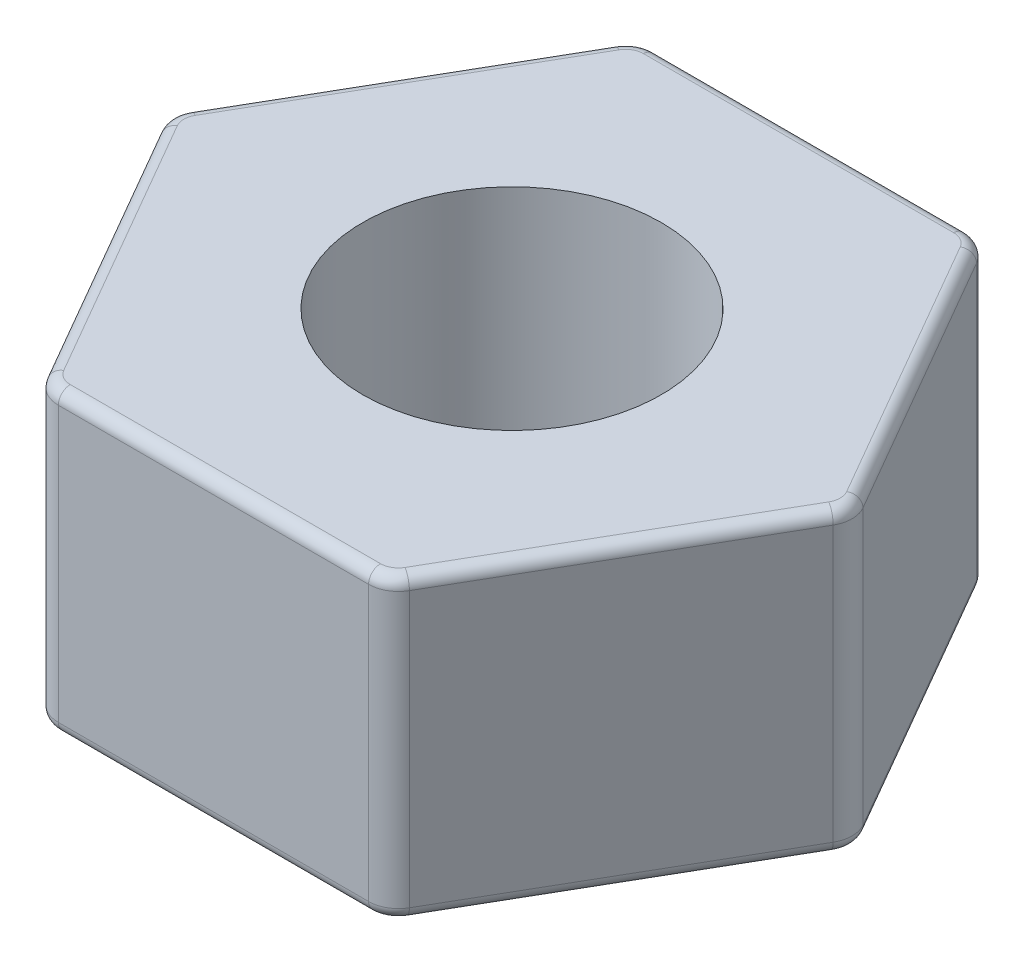
ISO-10303-21;
HEADER;
FILE_DESCRIPTION(('STEP AP214'),'2;1');
FILE_NAME('part.step','',(''),(''),'','','');
FILE_SCHEMA(('AUTOMOTIVE_DESIGN { 1 0 10303 214 1 1 1 1 }'));
ENDSEC;
DATA;
#1=APPLICATION_CONTEXT('core data for automotive mechanical design processes');
#2=APPLICATION_PROTOCOL_DEFINITION('international standard','automotive_design',2000,#1);
#3=PRODUCT_CONTEXT('',#1,'mechanical');
#4=PRODUCT('Part','Part','',(#3));
#5=PRODUCT_RELATED_PRODUCT_CATEGORY('part','',(#4));
#6=PRODUCT_DEFINITION_FORMATION('','',#4);
#7=PRODUCT_DEFINITION_CONTEXT('part definition',#1,'design');
#8=PRODUCT_DEFINITION('design','',#6,#7);
#9=PRODUCT_DEFINITION_SHAPE('','',#8);
#10=(LENGTH_UNIT() NAMED_UNIT(*) SI_UNIT(.MILLI.,.METRE.));
#11=(NAMED_UNIT(*) PLANE_ANGLE_UNIT() SI_UNIT($,.RADIAN.));
#12=(NAMED_UNIT(*) SI_UNIT($,.STERADIAN.) SOLID_ANGLE_UNIT());
#13=UNCERTAINTY_MEASURE_WITH_UNIT(LENGTH_MEASURE(1.E-05),#10,'distance_accuracy_value','');
#14=(GEOMETRIC_REPRESENTATION_CONTEXT(3) GLOBAL_UNCERTAINTY_ASSIGNED_CONTEXT((#13)) GLOBAL_UNIT_ASSIGNED_CONTEXT((#10,
#11,#12)) REPRESENTATION_CONTEXT('',''));
#15=CARTESIAN_POINT('',(0.,0.,0.));
#16=DIRECTION('',(0.,0.,1.));
#17=DIRECTION('',(1.,0.,0.));
#18=AXIS2_PLACEMENT_3D('',#15,#16,#17);
#19=CARTESIAN_POINT('',(-2.88675134594813,5.,-5.));
#20=DIRECTION('',(0.,1.,0.));
#21=DIRECTION('',(0.,0.,1.));
#22=AXIS2_PLACEMENT_3D('',#19,#20,#21);
#23=PLANE('',#22);
#24=DIRECTION('',(-1.,0.,0.));
#25=VECTOR('',#24,1.);
#26=CARTESIAN_POINT('',(-2.59807621135332,5.,-4.8));
#27=LINE('',#26,#25);
#28=CARTESIAN_POINT('',(2.59807621135332,5.,-4.8));
#29=VERTEX_POINT('',#28);
#30=CARTESIAN_POINT('',(-2.59807621135332,5.,-4.8));
#31=VERTEX_POINT('',#30);
#32=EDGE_CURVE('E56',#29,#31,#27,.T.);
#33=ORIENTED_EDGE('',*,*,#32,.T.);
#34=CARTESIAN_POINT('',(-2.59807621135332,5.,-4.5));
#35=DIRECTION('',(0.,1.,0.));
#36=DIRECTION('',(0.,0.,1.));
#37=AXIS2_PLACEMENT_3D('',#34,#35,#36);
#38=CIRCLE('',#37,0.3);
#39=CARTESIAN_POINT('',(-2.85788383248865,5.,-4.65));
#40=VERTEX_POINT('',#39);
#41=EDGE_CURVE('E318',#31,#40,#38,.T.);
#42=ORIENTED_EDGE('',*,*,#41,.T.);
#43=DIRECTION('',(-0.5,0.,0.866025403784439));
#44=VECTOR('',#43,1.);
#45=CARTESIAN_POINT('',(-5.45596004384196,5.,-0.150000000000003));
#46=LINE('',#45,#44);
#47=CARTESIAN_POINT('',(-5.45596004384196,5.,-0.150000000000003));
#48=VERTEX_POINT('',#47);
#49=EDGE_CURVE('E298',#40,#48,#46,.T.);
#50=ORIENTED_EDGE('',*,*,#49,.T.);
#51=CARTESIAN_POINT('',(-5.19615242270663,5.,0.));
#52=DIRECTION('',(0.,1.,0.));
#53=DIRECTION('',(0.,0.,1.));
#54=AXIS2_PLACEMENT_3D('',#51,#52,#53);
#55=CIRCLE('',#54,0.3);
#56=CARTESIAN_POINT('',(-5.45596004384196,5.,0.149999999999997));
#57=VERTEX_POINT('',#56);
#58=EDGE_CURVE('E300',#48,#57,#55,.T.);
#59=ORIENTED_EDGE('',*,*,#58,.T.);
#60=DIRECTION('',(0.5,0.,0.866025403784439));
#61=VECTOR('',#60,1.);
#62=CARTESIAN_POINT('',(-2.85788383248865,5.,4.65));
#63=LINE('',#62,#61);
#64=CARTESIAN_POINT('',(-2.85788383248865,5.,4.65));
#65=VERTEX_POINT('',#64);
#66=EDGE_CURVE('E302',#57,#65,#63,.T.);
#67=ORIENTED_EDGE('',*,*,#66,.T.);
#68=CARTESIAN_POINT('',(-2.59807621135332,5.,4.5));
#69=DIRECTION('',(0.,1.,0.));
#70=DIRECTION('',(0.,0.,1.));
#71=AXIS2_PLACEMENT_3D('',#68,#69,#70);
#72=CIRCLE('',#71,0.3);
#73=CARTESIAN_POINT('',(-2.59807621135332,5.,4.8));
#74=VERTEX_POINT('',#73);
#75=EDGE_CURVE('E304',#65,#74,#72,.T.);
#76=ORIENTED_EDGE('',*,*,#75,.T.);
#77=DIRECTION('',(1.,0.,0.));
#78=VECTOR('',#77,1.);
#79=CARTESIAN_POINT('',(2.59807621135332,5.,4.8));
#80=LINE('',#79,#78);
#81=CARTESIAN_POINT('',(2.59807621135332,5.,4.8));
#82=VERTEX_POINT('',#81);
#83=EDGE_CURVE('E306',#74,#82,#80,.T.);
#84=ORIENTED_EDGE('',*,*,#83,.T.);
#85=CARTESIAN_POINT('',(2.59807621135332,5.,4.5));
#86=DIRECTION('',(0.,1.,0.));
#87=DIRECTION('',(0.,0.,1.));
#88=AXIS2_PLACEMENT_3D('',#85,#86,#87);
#89=CIRCLE('',#88,0.3);
#90=CARTESIAN_POINT('',(2.85788383248865,5.,4.65));
#91=VERTEX_POINT('',#90);
#92=EDGE_CURVE('E308',#82,#91,#89,.T.);
#93=ORIENTED_EDGE('',*,*,#92,.T.);
#94=DIRECTION('',(0.5,0.,-0.866025403784439));
#95=VECTOR('',#94,1.);
#96=CARTESIAN_POINT('',(5.45596004384196,5.,0.149999999999999));
#97=LINE('',#96,#95);
#98=CARTESIAN_POINT('',(5.45596004384196,5.,0.149999999999999));
#99=VERTEX_POINT('',#98);
#100=EDGE_CURVE('E310',#91,#99,#97,.T.);
#101=ORIENTED_EDGE('',*,*,#100,.T.);
#102=CARTESIAN_POINT('',(5.19615242270663,5.,0.));
#103=DIRECTION('',(0.,1.,0.));
#104=DIRECTION('',(0.,0.,1.));
#105=AXIS2_PLACEMENT_3D('',#102,#103,#104);
#106=CIRCLE('',#105,0.3);
#107=CARTESIAN_POINT('',(5.45596004384196,5.,-0.150000000000002));
#108=VERTEX_POINT('',#107);
#109=EDGE_CURVE('E312',#99,#108,#106,.T.);
#110=ORIENTED_EDGE('',*,*,#109,.T.);
#111=DIRECTION('',(-0.5,0.,-0.866025403784439));
#112=VECTOR('',#111,1.);
#113=CARTESIAN_POINT('',(2.85788383248865,5.,-4.65));
#114=LINE('',#113,#112);
#115=CARTESIAN_POINT('',(2.85788383248865,5.,-4.65));
#116=VERTEX_POINT('',#115);
#117=EDGE_CURVE('E314',#108,#116,#114,.T.);
#118=ORIENTED_EDGE('',*,*,#117,.T.);
#119=CARTESIAN_POINT('',(2.59807621135332,5.,-4.5));
#120=DIRECTION('',(0.,1.,0.));
#121=DIRECTION('',(0.,0.,1.));
#122=AXIS2_PLACEMENT_3D('',#119,#120,#121);
#123=CIRCLE('',#122,0.3);
#124=EDGE_CURVE('E61',#116,#29,#123,.T.);
#125=ORIENTED_EDGE('',*,*,#124,.T.);
#126=EDGE_LOOP('',(#33,#42,#50,#59,#67,#76,#84,#93,#101,#110,#118,#125));
#127=FACE_BOUND('',#126,.T.);
#128=CARTESIAN_POINT('',(0.,5.,0.));
#129=DIRECTION('',(0.,1.,0.));
#130=DIRECTION('',(0.,0.,1.));
#131=AXIS2_PLACEMENT_3D('',#128,#129,#130);
#132=CIRCLE('',#131,2.5);
#133=CARTESIAN_POINT('',(0.,5.,2.5));
#134=VERTEX_POINT('',#133);
#135=EDGE_CURVE('E433',#134,#134,#132,.T.);
#136=ORIENTED_EDGE('',*,*,#135,.F.);
#137=EDGE_LOOP('',(#136));
#138=FACE_BOUND('',#137,.T.);
#139=ADVANCED_FACE('F39',(#127,#138),#23,.T.);
#140=CARTESIAN_POINT('',(-2.88675134594813,0.,-5.));
#141=DIRECTION('',(0.,1.,0.));
#142=DIRECTION('',(0.,0.,1.));
#143=AXIS2_PLACEMENT_3D('',#140,#141,#142);
#144=PLANE('',#143);
#145=DIRECTION('',(-0.5,0.,0.866025403784439));
#146=VECTOR('',#145,1.);
#147=CARTESIAN_POINT('',(-2.71354626519124,0.,-4.9));
#148=LINE('',#147,#146);
#149=CARTESIAN_POINT('',(-5.45596004384196,0.,-0.150000000000003));
#150=VERTEX_POINT('',#149);
#151=CARTESIAN_POINT('',(-2.85788383248865,0.,-4.65));
#152=VERTEX_POINT('',#151);
#153=EDGE_CURVE('E206',#150,#152,#148,.F.);
#154=ORIENTED_EDGE('',*,*,#153,.T.);
#155=CARTESIAN_POINT('',(-2.59807621135332,0.,-4.5));
#156=DIRECTION('',(0.,1.,0.));
#157=DIRECTION('',(0.,0.,1.));
#158=AXIS2_PLACEMENT_3D('',#155,#156,#157);
#159=CIRCLE('',#158,0.3);
#160=CARTESIAN_POINT('',(-2.59807621135332,0.,-4.8));
#161=VERTEX_POINT('',#160);
#162=EDGE_CURVE('E251',#152,#161,#159,.F.);
#163=ORIENTED_EDGE('',*,*,#162,.T.);
#164=DIRECTION('',(-1.,0.,0.));
#165=VECTOR('',#164,1.);
#166=CARTESIAN_POINT('',(-2.88675134594813,0.,-4.8));
#167=LINE('',#166,#165);
#168=CARTESIAN_POINT('',(2.59807621135332,0.,-4.8));
#169=VERTEX_POINT('',#168);
#170=EDGE_CURVE('E249',#161,#169,#167,.F.);
#171=ORIENTED_EDGE('',*,*,#170,.T.);
#172=CARTESIAN_POINT('',(2.59807621135332,0.,-4.5));
#173=DIRECTION('',(0.,1.,0.));
#174=DIRECTION('',(0.,0.,1.));
#175=AXIS2_PLACEMENT_3D('',#172,#173,#174);
#176=CIRCLE('',#175,0.3);
#177=CARTESIAN_POINT('',(2.85788383248865,0.,-4.65));
#178=VERTEX_POINT('',#177);
#179=EDGE_CURVE('E247',#169,#178,#176,.F.);
#180=ORIENTED_EDGE('',*,*,#179,.T.);
#181=DIRECTION('',(-0.5,0.,-0.866025403784439));
#182=VECTOR('',#181,1.);
#183=CARTESIAN_POINT('',(1.27017059221718,0.,-7.4));
#184=LINE('',#183,#182);
#185=CARTESIAN_POINT('',(5.45596004384196,0.,-0.150000000000002));
#186=VERTEX_POINT('',#185);
#187=EDGE_CURVE('E245',#178,#186,#184,.F.);
#188=ORIENTED_EDGE('',*,*,#187,.T.);
#189=CARTESIAN_POINT('',(5.19615242270663,0.,0.));
#190=DIRECTION('',(0.,1.,0.));
#191=DIRECTION('',(0.,0.,1.));
#192=AXIS2_PLACEMENT_3D('',#189,#190,#191);
#193=CIRCLE('',#192,0.3);
#194=CARTESIAN_POINT('',(5.45596004384196,0.,0.149999999999999));
#195=VERTEX_POINT('',#194);
#196=EDGE_CURVE('E243',#186,#195,#193,.F.);
#197=ORIENTED_EDGE('',*,*,#196,.T.);
#198=DIRECTION('',(0.5,0.,-0.866025403784439));
#199=VECTOR('',#198,1.);
#200=CARTESIAN_POINT('',(5.60029761113937,0.,-0.0999999999999985));
#201=LINE('',#200,#199);
#202=CARTESIAN_POINT('',(2.85788383248865,0.,4.65));
#203=VERTEX_POINT('',#202);
#204=EDGE_CURVE('E241',#195,#203,#201,.F.);
#205=ORIENTED_EDGE('',*,*,#204,.T.);
#206=CARTESIAN_POINT('',(2.59807621135332,0.,4.5));
#207=DIRECTION('',(0.,1.,0.));
#208=DIRECTION('',(0.,0.,1.));
#209=AXIS2_PLACEMENT_3D('',#206,#207,#208);
#210=CIRCLE('',#209,0.3);
#211=CARTESIAN_POINT('',(2.59807621135332,0.,4.8));
#212=VERTEX_POINT('',#211);
#213=EDGE_CURVE('E239',#203,#212,#210,.F.);
#214=ORIENTED_EDGE('',*,*,#213,.T.);
#215=DIRECTION('',(1.,0.,0.));
#216=VECTOR('',#215,1.);
#217=CARTESIAN_POINT('',(-2.88675134594813,0.,4.8));
#218=LINE('',#217,#216);
#219=CARTESIAN_POINT('',(-2.59807621135332,0.,4.8));
#220=VERTEX_POINT('',#219);
#221=EDGE_CURVE('E237',#212,#220,#218,.F.);
#222=ORIENTED_EDGE('',*,*,#221,.T.);
#223=CARTESIAN_POINT('',(-2.59807621135332,0.,4.5));
#224=DIRECTION('',(0.,1.,0.));
#225=DIRECTION('',(0.,0.,1.));
#226=AXIS2_PLACEMENT_3D('',#223,#224,#225);
#227=CIRCLE('',#226,0.3);
#228=CARTESIAN_POINT('',(-2.85788383248865,0.,4.65));
#229=VERTEX_POINT('',#228);
#230=EDGE_CURVE('E235',#220,#229,#227,.F.);
#231=ORIENTED_EDGE('',*,*,#230,.T.);
#232=DIRECTION('',(0.5,0.,0.866025403784439));
#233=VECTOR('',#232,1.);
#234=CARTESIAN_POINT('',(-7.04367328411343,0.,-2.6));
#235=LINE('',#234,#233);
#236=CARTESIAN_POINT('',(-5.45596004384196,0.,0.149999999999997));
#237=VERTEX_POINT('',#236);
#238=EDGE_CURVE('E209',#229,#237,#235,.F.);
#239=ORIENTED_EDGE('',*,*,#238,.T.);
#240=CARTESIAN_POINT('',(-5.19615242270663,0.,0.));
#241=DIRECTION('',(0.,1.,0.));
#242=DIRECTION('',(0.,0.,1.));
#243=AXIS2_PLACEMENT_3D('',#240,#241,#242);
#244=CIRCLE('',#243,0.3);
#245=EDGE_CURVE('E200',#237,#150,#244,.F.);
#246=ORIENTED_EDGE('',*,*,#245,.T.);
#247=EDGE_LOOP('',(#154,#163,#171,#180,#188,#197,#205,#214,#222,#231,#239,#246));
#248=FACE_BOUND('',#247,.T.);
#249=CARTESIAN_POINT('',(0.,0.,0.));
#250=DIRECTION('',(0.,1.,0.));
#251=DIRECTION('',(0.,0.,1.));
#252=AXIS2_PLACEMENT_3D('',#249,#250,#251);
#253=CIRCLE('',#252,2.5);
#254=CARTESIAN_POINT('',(0.,0.,2.5));
#255=VERTEX_POINT('',#254);
#256=EDGE_CURVE('E348',#255,#255,#253,.T.);
#257=ORIENTED_EDGE('',*,*,#256,.T.);
#258=EDGE_LOOP('',(#257));
#259=FACE_BOUND('',#258,.T.);
#260=ADVANCED_FACE('F202',(#248,#259),#144,.F.);
#261=CARTESIAN_POINT('',(2.88675134594813,5.,-5.));
#262=DIRECTION('',(0.,0.,1.));
#263=DIRECTION('',(1.,0.,0.));
#264=AXIS2_PLACEMENT_3D('',#261,#262,#263);
#265=PLANE('',#264);
#266=DIRECTION('',(0.,-1.,0.));
#267=VECTOR('',#266,1.);
#268=CARTESIAN_POINT('',(2.59807621135332,5.,-5.));
#269=LINE('',#268,#267);
#270=CARTESIAN_POINT('',(2.59807621135332,4.8,-5.));
#271=VERTEX_POINT('',#270);
#272=CARTESIAN_POINT('',(2.59807621135332,0.2,-5.));
#273=VERTEX_POINT('',#272);
#274=EDGE_CURVE('E424',#271,#273,#269,.T.);
#275=ORIENTED_EDGE('',*,*,#274,.T.);
#276=DIRECTION('',(-1.,0.,0.));
#277=VECTOR('',#276,1.);
#278=CARTESIAN_POINT('',(2.88675134594813,0.2,-5.));
#279=LINE('',#278,#277);
#280=CARTESIAN_POINT('',(-2.59807621135332,0.2,-5.));
#281=VERTEX_POINT('',#280);
#282=EDGE_CURVE('E261',#273,#281,#279,.T.);
#283=ORIENTED_EDGE('',*,*,#282,.T.);
#284=DIRECTION('',(0.,-1.,0.));
#285=VECTOR('',#284,1.);
#286=CARTESIAN_POINT('',(-2.59807621135332,5.,-5.));
#287=LINE('',#286,#285);
#288=CARTESIAN_POINT('',(-2.59807621135332,4.8,-5.));
#289=VERTEX_POINT('',#288);
#290=EDGE_CURVE('E421',#281,#289,#287,.F.);
#291=ORIENTED_EDGE('',*,*,#290,.T.);
#292=DIRECTION('',(-1.,0.,0.));
#293=VECTOR('',#292,1.);
#294=CARTESIAN_POINT('',(2.59807621135332,4.8,-5.));
#295=LINE('',#294,#293);
#296=EDGE_CURVE('E259',#289,#271,#295,.F.);
#297=ORIENTED_EDGE('',*,*,#296,.T.);
#298=EDGE_LOOP('',(#275,#283,#291,#297));
#299=FACE_BOUND('',#298,.T.);
#300=ADVANCED_FACE('F448',(#299),#265,.F.);
#301=CARTESIAN_POINT('',(-2.88675134594813,5.,-5.));
#302=DIRECTION('',(0.866025403784439,0.,0.5));
#303=DIRECTION('',(0.5,0.,-0.866025403784439));
#304=AXIS2_PLACEMENT_3D('',#301,#302,#303);
#305=PLANE('',#304);
#306=DIRECTION('',(0.,-1.,0.));
#307=VECTOR('',#306,1.);
#308=CARTESIAN_POINT('',(-3.03108891324554,5.,-4.75));
#309=LINE('',#308,#307);
#310=CARTESIAN_POINT('',(-3.03108891324554,4.8,-4.75));
#311=VERTEX_POINT('',#310);
#312=CARTESIAN_POINT('',(-3.03108891324554,0.2,-4.75));
#313=VERTEX_POINT('',#312);
#314=EDGE_CURVE('E427',#311,#313,#309,.T.);
#315=ORIENTED_EDGE('',*,*,#314,.T.);
#316=DIRECTION('',(-0.5,0.,0.866025403784439));
#317=VECTOR('',#316,1.);
#318=CARTESIAN_POINT('',(-2.88675134594813,0.2,-5.));
#319=LINE('',#318,#317);
#320=CARTESIAN_POINT('',(-5.62916512459885,0.2,-0.250000000000003));
#321=VERTEX_POINT('',#320);
#322=EDGE_CURVE('E11',#313,#321,#319,.T.);
#323=ORIENTED_EDGE('',*,*,#322,.T.);
#324=DIRECTION('',(0.,-1.,0.));
#325=VECTOR('',#324,1.);
#326=CARTESIAN_POINT('',(-5.62916512459885,5.,-0.250000000000003));
#327=LINE('',#326,#325);
#328=CARTESIAN_POINT('',(-5.62916512459885,4.8,-0.250000000000003));
#329=VERTEX_POINT('',#328);
#330=EDGE_CURVE('E430',#321,#329,#327,.F.);
#331=ORIENTED_EDGE('',*,*,#330,.T.);
#332=DIRECTION('',(-0.5,0.,0.866025403784439));
#333=VECTOR('',#332,1.);
#334=CARTESIAN_POINT('',(-3.03108891324554,4.8,-4.75));
#335=LINE('',#334,#333);
#336=EDGE_CURVE('E48',#329,#311,#335,.F.);
#337=ORIENTED_EDGE('',*,*,#336,.T.);
#338=EDGE_LOOP('',(#315,#323,#331,#337));
#339=FACE_BOUND('',#338,.T.);
#340=ADVANCED_FACE('F465',(#339),#305,.F.);
#341=CARTESIAN_POINT('',(-5.77350269189626,5.,0.));
#342=DIRECTION('',(0.866025403784439,0.,-0.5));
#343=DIRECTION('',(-0.5,0.,-0.866025403784439));
#344=AXIS2_PLACEMENT_3D('',#341,#342,#343);
#345=PLANE('',#344);
#346=DIRECTION('',(0.,-1.,0.));
#347=VECTOR('',#346,1.);
#348=CARTESIAN_POINT('',(-5.62916512459885,5.,0.249999999999997));
#349=LINE('',#348,#347);
#350=CARTESIAN_POINT('',(-5.62916512459885,4.8,0.249999999999997));
#351=VERTEX_POINT('',#350);
#352=CARTESIAN_POINT('',(-5.62916512459885,0.2,0.249999999999997));
#353=VERTEX_POINT('',#352);
#354=EDGE_CURVE('E227',#351,#353,#349,.T.);
#355=ORIENTED_EDGE('',*,*,#354,.T.);
#356=DIRECTION('',(0.5,0.,0.866025403784439));
#357=VECTOR('',#356,1.);
#358=CARTESIAN_POINT('',(-5.77350269189626,0.2,0.));
#359=LINE('',#358,#357);
#360=CARTESIAN_POINT('',(-3.03108891324554,0.2,4.75));
#361=VERTEX_POINT('',#360);
#362=EDGE_CURVE('E293',#353,#361,#359,.T.);
#363=ORIENTED_EDGE('',*,*,#362,.T.);
#364=DIRECTION('',(0.,-1.,0.));
#365=VECTOR('',#364,1.);
#366=CARTESIAN_POINT('',(-3.03108891324554,5.,4.75));
#367=LINE('',#366,#365);
#368=CARTESIAN_POINT('',(-3.03108891324554,4.8,4.75));
#369=VERTEX_POINT('',#368);
#370=EDGE_CURVE('E230',#361,#369,#367,.F.);
#371=ORIENTED_EDGE('',*,*,#370,.T.);
#372=DIRECTION('',(0.5,0.,0.866025403784439));
#373=VECTOR('',#372,1.);
#374=CARTESIAN_POINT('',(-5.62916512459885,4.8,0.249999999999997));
#375=LINE('',#374,#373);
#376=EDGE_CURVE('E291',#369,#351,#375,.F.);
#377=ORIENTED_EDGE('',*,*,#376,.T.);
#378=EDGE_LOOP('',(#355,#363,#371,#377));
#379=FACE_BOUND('',#378,.T.);
#380=ADVANCED_FACE('F462',(#379),#345,.F.);
#381=CARTESIAN_POINT('',(-2.88675134594813,5.,5.));
#382=DIRECTION('',(0.,0.,-1.));
#383=DIRECTION('',(-1.,0.,0.));
#384=AXIS2_PLACEMENT_3D('',#381,#382,#383);
#385=PLANE('',#384);
#386=DIRECTION('',(0.,-1.,0.));
#387=VECTOR('',#386,1.);
#388=CARTESIAN_POINT('',(-2.59807621135332,5.,5.));
#389=LINE('',#388,#387);
#390=CARTESIAN_POINT('',(-2.59807621135332,4.8,5.));
#391=VERTEX_POINT('',#390);
#392=CARTESIAN_POINT('',(-2.59807621135332,0.2,5.));
#393=VERTEX_POINT('',#392);
#394=EDGE_CURVE('E406',#391,#393,#389,.T.);
#395=ORIENTED_EDGE('',*,*,#394,.T.);
#396=DIRECTION('',(1.,0.,0.));
#397=VECTOR('',#396,1.);
#398=CARTESIAN_POINT('',(-2.88675134594813,0.2,5.));
#399=LINE('',#398,#397);
#400=CARTESIAN_POINT('',(2.59807621135332,0.2,5.));
#401=VERTEX_POINT('',#400);
#402=EDGE_CURVE('E285',#393,#401,#399,.T.);
#403=ORIENTED_EDGE('',*,*,#402,.T.);
#404=DIRECTION('',(0.,-1.,0.));
#405=VECTOR('',#404,1.);
#406=CARTESIAN_POINT('',(2.59807621135332,5.,5.));
#407=LINE('',#406,#405);
#408=CARTESIAN_POINT('',(2.59807621135332,4.8,5.));
#409=VERTEX_POINT('',#408);
#410=EDGE_CURVE('E397',#401,#409,#407,.F.);
#411=ORIENTED_EDGE('',*,*,#410,.T.);
#412=DIRECTION('',(1.,0.,0.));
#413=VECTOR('',#412,1.);
#414=CARTESIAN_POINT('',(-2.59807621135332,4.8,5.));
#415=LINE('',#414,#413);
#416=EDGE_CURVE('E283',#409,#391,#415,.F.);
#417=ORIENTED_EDGE('',*,*,#416,.T.);
#418=EDGE_LOOP('',(#395,#403,#411,#417));
#419=FACE_BOUND('',#418,.T.);
#420=ADVANCED_FACE('F403',(#419),#385,.F.);
#421=CARTESIAN_POINT('',(2.88675134594813,5.,5.));
#422=DIRECTION('',(-0.866025403784438,0.,-0.5));
#423=DIRECTION('',(-0.5,0.,0.866025403784439));
#424=AXIS2_PLACEMENT_3D('',#421,#422,#423);
#425=PLANE('',#424);
#426=DIRECTION('',(0.,-1.,0.));
#427=VECTOR('',#426,1.);
#428=CARTESIAN_POINT('',(3.03108891324553,5.,4.75));
#429=LINE('',#428,#427);
#430=CARTESIAN_POINT('',(3.03108891324553,4.8,4.75));
#431=VERTEX_POINT('',#430);
#432=CARTESIAN_POINT('',(3.03108891324553,0.2,4.75));
#433=VERTEX_POINT('',#432);
#434=EDGE_CURVE('E400',#431,#433,#429,.T.);
#435=ORIENTED_EDGE('',*,*,#434,.T.);
#436=DIRECTION('',(0.5,0.,-0.866025403784439));
#437=VECTOR('',#436,1.);
#438=CARTESIAN_POINT('',(2.88675134594813,0.2,5.));
#439=LINE('',#438,#437);
#440=CARTESIAN_POINT('',(5.62916512459885,0.2,0.249999999999999));
#441=VERTEX_POINT('',#440);
#442=EDGE_CURVE('E277',#433,#441,#439,.T.);
#443=ORIENTED_EDGE('',*,*,#442,.T.);
#444=DIRECTION('',(0.,-1.,0.));
#445=VECTOR('',#444,1.);
#446=CARTESIAN_POINT('',(5.62916512459885,5.,0.249999999999999));
#447=LINE('',#446,#445);
#448=CARTESIAN_POINT('',(5.62916512459885,4.8,0.249999999999999));
#449=VERTEX_POINT('',#448);
#450=EDGE_CURVE('E409',#441,#449,#447,.F.);
#451=ORIENTED_EDGE('',*,*,#450,.T.);
#452=DIRECTION('',(0.5,0.,-0.866025403784439));
#453=VECTOR('',#452,1.);
#454=CARTESIAN_POINT('',(3.03108891324553,4.8,4.75));
#455=LINE('',#454,#453);
#456=EDGE_CURVE('E275',#449,#431,#455,.F.);
#457=ORIENTED_EDGE('',*,*,#456,.T.);
#458=EDGE_LOOP('',(#435,#443,#451,#457));
#459=FACE_BOUND('',#458,.T.);
#460=ADVANCED_FACE('F455',(#459),#425,.F.);
#461=CARTESIAN_POINT('',(5.77350269189626,5.,0.));
#462=DIRECTION('',(-0.866025403784439,0.,0.5));
#463=DIRECTION('',(0.5,0.,0.866025403784439));
#464=AXIS2_PLACEMENT_3D('',#461,#462,#463);
#465=PLANE('',#464);
#466=DIRECTION('',(0.,-1.,0.));
#467=VECTOR('',#466,1.);
#468=CARTESIAN_POINT('',(5.62916512459885,5.,-0.250000000000002));
#469=LINE('',#468,#467);
#470=CARTESIAN_POINT('',(5.62916512459885,4.8,-0.250000000000002));
#471=VERTEX_POINT('',#470);
#472=CARTESIAN_POINT('',(5.62916512459885,0.2,-0.250000000000002));
#473=VERTEX_POINT('',#472);
#474=EDGE_CURVE('E418',#471,#473,#469,.T.);
#475=ORIENTED_EDGE('',*,*,#474,.T.);
#476=DIRECTION('',(-0.5,0.,-0.866025403784439));
#477=VECTOR('',#476,1.);
#478=CARTESIAN_POINT('',(5.77350269189626,0.2,0.));
#479=LINE('',#478,#477);
#480=CARTESIAN_POINT('',(3.03108891324554,0.2,-4.75));
#481=VERTEX_POINT('',#480);
#482=EDGE_CURVE('E269',#473,#481,#479,.T.);
#483=ORIENTED_EDGE('',*,*,#482,.T.);
#484=DIRECTION('',(0.,-1.,0.));
#485=VECTOR('',#484,1.);
#486=CARTESIAN_POINT('',(3.03108891324554,5.,-4.75));
#487=LINE('',#486,#485);
#488=CARTESIAN_POINT('',(3.03108891324554,4.8,-4.75));
#489=VERTEX_POINT('',#488);
#490=EDGE_CURVE('E415',#481,#489,#487,.F.);
#491=ORIENTED_EDGE('',*,*,#490,.T.);
#492=DIRECTION('',(-0.5,0.,-0.866025403784439));
#493=VECTOR('',#492,1.);
#494=CARTESIAN_POINT('',(5.62916512459885,4.8,-0.250000000000001));
#495=LINE('',#494,#493);
#496=EDGE_CURVE('E267',#489,#471,#495,.F.);
#497=ORIENTED_EDGE('',*,*,#496,.T.);
#498=EDGE_LOOP('',(#475,#483,#491,#497));
#499=FACE_BOUND('',#498,.T.);
#500=ADVANCED_FACE('F452',(#499),#465,.F.);
#501=CARTESIAN_POINT('',(0.,5.,0.));
#502=DIRECTION('',(0.,-1.,0.));
#503=DIRECTION('',(0.,0.,-1.));
#504=AXIS2_PLACEMENT_3D('',#501,#502,#503);
#505=CYLINDRICAL_SURFACE('',#504,2.5);
#506=ORIENTED_EDGE('',*,*,#135,.T.);
#507=EDGE_LOOP('',(#506));
#508=FACE_BOUND('',#507,.T.);
#509=ORIENTED_EDGE('',*,*,#256,.F.);
#510=EDGE_LOOP('',(#509));
#511=FACE_BOUND('',#510,.T.);
#512=ADVANCED_FACE('F439',(#508,#511),#505,.F.);
#513=CARTESIAN_POINT('',(-2.59807621135332,5.,-4.5));
#514=DIRECTION('',(0.,-1.,0.));
#515=DIRECTION('',(0.,0.,-1.));
#516=AXIS2_PLACEMENT_3D('',#513,#514,#515);
#517=CYLINDRICAL_SURFACE('',#516,0.5);
#518=ORIENTED_EDGE('',*,*,#290,.F.);
#519=CARTESIAN_POINT('',(-2.59807621135332,0.2,-4.5));
#520=DIRECTION('',(0.,1.,0.));
#521=DIRECTION('',(0.,0.,1.));
#522=AXIS2_PLACEMENT_3D('',#519,#520,#521);
#523=CIRCLE('',#522,0.5);
#524=EDGE_CURVE('E256',#281,#313,#523,.T.);
#525=ORIENTED_EDGE('',*,*,#524,.T.);
#526=ORIENTED_EDGE('',*,*,#314,.F.);
#527=CARTESIAN_POINT('',(-2.59807621135332,4.8,-4.5));
#528=DIRECTION('',(0.,1.,0.));
#529=DIRECTION('',(0.,0.,1.));
#530=AXIS2_PLACEMENT_3D('',#527,#528,#529);
#531=CIRCLE('',#530,0.5);
#532=EDGE_CURVE('E253',#311,#289,#531,.F.);
#533=ORIENTED_EDGE('',*,*,#532,.T.);
#534=EDGE_LOOP('',(#518,#525,#526,#533));
#535=FACE_BOUND('',#534,.T.);
#536=ADVANCED_FACE('F473',(#535),#517,.T.);
#537=CARTESIAN_POINT('',(2.59807621135332,5.,-4.5));
#538=DIRECTION('',(0.,-1.,0.));
#539=DIRECTION('',(0.,0.,-1.));
#540=AXIS2_PLACEMENT_3D('',#537,#538,#539);
#541=CYLINDRICAL_SURFACE('',#540,0.5);
#542=ORIENTED_EDGE('',*,*,#490,.F.);
#543=CARTESIAN_POINT('',(2.59807621135332,0.2,-4.5));
#544=DIRECTION('',(0.,1.,0.));
#545=DIRECTION('',(0.,0.,1.));
#546=AXIS2_PLACEMENT_3D('',#543,#544,#545);
#547=CIRCLE('',#546,0.5);
#548=EDGE_CURVE('E265',#481,#273,#547,.T.);
#549=ORIENTED_EDGE('',*,*,#548,.T.);
#550=ORIENTED_EDGE('',*,*,#274,.F.);
#551=CARTESIAN_POINT('',(2.59807621135332,4.8,-4.5));
#552=DIRECTION('',(0.,1.,0.));
#553=DIRECTION('',(0.,0.,1.));
#554=AXIS2_PLACEMENT_3D('',#551,#552,#553);
#555=CIRCLE('',#554,0.5);
#556=EDGE_CURVE('E263',#271,#489,#555,.F.);
#557=ORIENTED_EDGE('',*,*,#556,.T.);
#558=EDGE_LOOP('',(#542,#549,#550,#557));
#559=FACE_BOUND('',#558,.T.);
#560=ADVANCED_FACE('F476',(#559),#541,.T.);
#561=CARTESIAN_POINT('',(5.19615242270663,5.,0.));
#562=DIRECTION('',(0.,-1.,0.));
#563=DIRECTION('',(0.,0.,-1.));
#564=AXIS2_PLACEMENT_3D('',#561,#562,#563);
#565=CYLINDRICAL_SURFACE('',#564,0.5);
#566=ORIENTED_EDGE('',*,*,#450,.F.);
#567=CARTESIAN_POINT('',(5.19615242270663,0.2,0.));
#568=DIRECTION('',(0.,1.,0.));
#569=DIRECTION('',(0.,0.,1.));
#570=AXIS2_PLACEMENT_3D('',#567,#568,#569);
#571=CIRCLE('',#570,0.5);
#572=EDGE_CURVE('E273',#441,#473,#571,.T.);
#573=ORIENTED_EDGE('',*,*,#572,.T.);
#574=ORIENTED_EDGE('',*,*,#474,.F.);
#575=CARTESIAN_POINT('',(5.19615242270663,4.8,0.));
#576=DIRECTION('',(0.,1.,0.));
#577=DIRECTION('',(0.,0.,1.));
#578=AXIS2_PLACEMENT_3D('',#575,#576,#577);
#579=CIRCLE('',#578,0.5);
#580=EDGE_CURVE('E271',#471,#449,#579,.F.);
#581=ORIENTED_EDGE('',*,*,#580,.T.);
#582=EDGE_LOOP('',(#566,#573,#574,#581));
#583=FACE_BOUND('',#582,.T.);
#584=ADVANCED_FACE('F480',(#583),#565,.T.);
#585=CARTESIAN_POINT('',(2.59807621135332,5.,4.5));
#586=DIRECTION('',(0.,-1.,0.));
#587=DIRECTION('',(0.,0.,-1.));
#588=AXIS2_PLACEMENT_3D('',#585,#586,#587);
#589=CYLINDRICAL_SURFACE('',#588,0.5);
#590=ORIENTED_EDGE('',*,*,#410,.F.);
#591=CARTESIAN_POINT('',(2.59807621135332,0.2,4.5));
#592=DIRECTION('',(0.,1.,0.));
#593=DIRECTION('',(0.,0.,1.));
#594=AXIS2_PLACEMENT_3D('',#591,#592,#593);
#595=CIRCLE('',#594,0.5);
#596=EDGE_CURVE('E281',#401,#433,#595,.T.);
#597=ORIENTED_EDGE('',*,*,#596,.T.);
#598=ORIENTED_EDGE('',*,*,#434,.F.);
#599=CARTESIAN_POINT('',(2.59807621135332,4.8,4.5));
#600=DIRECTION('',(0.,1.,0.));
#601=DIRECTION('',(0.,0.,1.));
#602=AXIS2_PLACEMENT_3D('',#599,#600,#601);
#603=CIRCLE('',#602,0.5);
#604=EDGE_CURVE('E279',#431,#409,#603,.F.);
#605=ORIENTED_EDGE('',*,*,#604,.T.);
#606=EDGE_LOOP('',(#590,#597,#598,#605));
#607=FACE_BOUND('',#606,.T.);
#608=ADVANCED_FACE('F396',(#607),#589,.T.);
#609=CARTESIAN_POINT('',(-5.19615242270663,5.,0.));
#610=DIRECTION('',(0.,-1.,0.));
#611=DIRECTION('',(0.,0.,-1.));
#612=AXIS2_PLACEMENT_3D('',#609,#610,#611);
#613=CYLINDRICAL_SURFACE('',#612,0.5);
#614=ORIENTED_EDGE('',*,*,#330,.F.);
#615=CARTESIAN_POINT('',(-5.19615242270663,0.2,0.));
#616=DIRECTION('',(0.,1.,0.));
#617=DIRECTION('',(0.,0.,1.));
#618=AXIS2_PLACEMENT_3D('',#615,#616,#617);
#619=CIRCLE('',#618,0.5);
#620=EDGE_CURVE('E218',#321,#353,#619,.T.);
#621=ORIENTED_EDGE('',*,*,#620,.T.);
#622=ORIENTED_EDGE('',*,*,#354,.F.);
#623=CARTESIAN_POINT('',(-5.19615242270663,4.8,0.));
#624=DIRECTION('',(0.,1.,0.));
#625=DIRECTION('',(0.,0.,1.));
#626=AXIS2_PLACEMENT_3D('',#623,#624,#625);
#627=CIRCLE('',#626,0.5);
#628=EDGE_CURVE('E295',#351,#329,#627,.F.);
#629=ORIENTED_EDGE('',*,*,#628,.T.);
#630=EDGE_LOOP('',(#614,#621,#622,#629));
#631=FACE_BOUND('',#630,.T.);
#632=ADVANCED_FACE('F487',(#631),#613,.T.);
#633=CARTESIAN_POINT('',(-2.59807621135332,5.,4.5));
#634=DIRECTION('',(0.,-1.,0.));
#635=DIRECTION('',(0.,0.,-1.));
#636=AXIS2_PLACEMENT_3D('',#633,#634,#635);
#637=CYLINDRICAL_SURFACE('',#636,0.5);
#638=ORIENTED_EDGE('',*,*,#370,.F.);
#639=CARTESIAN_POINT('',(-2.59807621135332,0.2,4.5));
#640=DIRECTION('',(0.,1.,0.));
#641=DIRECTION('',(0.,0.,1.));
#642=AXIS2_PLACEMENT_3D('',#639,#640,#641);
#643=CIRCLE('',#642,0.5);
#644=EDGE_CURVE('E289',#361,#393,#643,.T.);
#645=ORIENTED_EDGE('',*,*,#644,.T.);
#646=ORIENTED_EDGE('',*,*,#394,.F.);
#647=CARTESIAN_POINT('',(-2.59807621135332,4.8,4.5));
#648=DIRECTION('',(0.,1.,0.));
#649=DIRECTION('',(0.,0.,1.));
#650=AXIS2_PLACEMENT_3D('',#647,#648,#649);
#651=CIRCLE('',#650,0.5);
#652=EDGE_CURVE('E287',#391,#369,#651,.F.);
#653=ORIENTED_EDGE('',*,*,#652,.T.);
#654=EDGE_LOOP('',(#638,#645,#646,#653));
#655=FACE_BOUND('',#654,.T.);
#656=ADVANCED_FACE('F490',(#655),#637,.T.);
#657=CARTESIAN_POINT('',(2.59807621135332,0.2,4.5));
#658=DIRECTION('',(0.,1.,0.));
#659=DIRECTION('',(0.,0.,1.));
#660=AXIS2_PLACEMENT_3D('',#657,#658,#659);
#661=TOROIDAL_SURFACE('',#660,0.3,0.2);
#662=CARTESIAN_POINT('',(2.85788383248865,0.2,4.65));
#663=DIRECTION('',(0.500000000000001,0.,-0.866025403784438));
#664=DIRECTION('',(-0.866025403784438,0.,-0.500000000000001));
#665=AXIS2_PLACEMENT_3D('',#662,#663,#664);
#666=CIRCLE('',#665,0.2);
#667=EDGE_CURVE('E342',#433,#203,#666,.T.);
#668=ORIENTED_EDGE('',*,*,#667,.F.);
#669=ORIENTED_EDGE('',*,*,#596,.F.);
#670=CARTESIAN_POINT('',(2.59807621135332,0.2,4.8));
#671=DIRECTION('',(-1.,0.,0.));
#672=DIRECTION('',(0.,0.,1.));
#673=AXIS2_PLACEMENT_3D('',#670,#671,#672);
#674=CIRCLE('',#673,0.2);
#675=EDGE_CURVE('E345',#212,#401,#674,.T.);
#676=ORIENTED_EDGE('',*,*,#675,.F.);
#677=ORIENTED_EDGE('',*,*,#213,.F.);
#678=EDGE_LOOP('',(#668,#669,#676,#677));
#679=FACE_BOUND('',#678,.T.);
#680=ADVANCED_FACE('F494',(#679),#661,.T.);
#681=CARTESIAN_POINT('',(-2.88675134594813,0.2,4.8));
#682=DIRECTION('',(1.,0.,0.));
#683=DIRECTION('',(0.,0.,-1.));
#684=AXIS2_PLACEMENT_3D('',#681,#682,#683);
#685=CYLINDRICAL_SURFACE('',#684,0.2);
#686=ORIENTED_EDGE('',*,*,#675,.T.);
#687=ORIENTED_EDGE('',*,*,#402,.F.);
#688=CARTESIAN_POINT('',(-2.59807621135332,0.2,4.8));
#689=DIRECTION('',(-1.,0.,0.));
#690=DIRECTION('',(0.,0.,1.));
#691=AXIS2_PLACEMENT_3D('',#688,#689,#690);
#692=CIRCLE('',#691,0.2);
#693=EDGE_CURVE('E339',#220,#393,#692,.T.);
#694=ORIENTED_EDGE('',*,*,#693,.F.);
#695=ORIENTED_EDGE('',*,*,#221,.F.);
#696=EDGE_LOOP('',(#686,#687,#694,#695));
#697=FACE_BOUND('',#696,.T.);
#698=ADVANCED_FACE('F531',(#697),#685,.T.);
#699=CARTESIAN_POINT('',(2.71354626519124,0.2,4.9));
#700=DIRECTION('',(0.5,0.,-0.866025403784439));
#701=DIRECTION('',(-0.866025403784438,0.,-0.5));
#702=AXIS2_PLACEMENT_3D('',#699,#700,#701);
#703=CYLINDRICAL_SURFACE('',#702,0.2);
#704=ORIENTED_EDGE('',*,*,#667,.T.);
#705=ORIENTED_EDGE('',*,*,#204,.F.);
#706=CARTESIAN_POINT('',(5.45596004384196,0.2,0.149999999999999));
#707=DIRECTION('',(0.500000000000001,0.,-0.866025403784438));
#708=DIRECTION('',(-0.866025403784438,0.,-0.500000000000001));
#709=AXIS2_PLACEMENT_3D('',#706,#707,#708);
#710=CIRCLE('',#709,0.2);
#711=EDGE_CURVE('E336',#441,#195,#710,.T.);
#712=ORIENTED_EDGE('',*,*,#711,.F.);
#713=ORIENTED_EDGE('',*,*,#442,.F.);
#714=EDGE_LOOP('',(#704,#705,#712,#713));
#715=FACE_BOUND('',#714,.T.);
#716=ADVANCED_FACE('F527',(#715),#703,.T.);
#717=CARTESIAN_POINT('',(-2.59807621135332,0.2,4.5));
#718=DIRECTION('',(0.,1.,0.));
#719=DIRECTION('',(0.,0.,1.));
#720=AXIS2_PLACEMENT_3D('',#717,#718,#719);
#721=TOROIDAL_SURFACE('',#720,0.3,0.2);
#722=ORIENTED_EDGE('',*,*,#693,.T.);
#723=ORIENTED_EDGE('',*,*,#644,.F.);
#724=CARTESIAN_POINT('',(-2.85788383248865,0.2,4.65));
#725=DIRECTION('',(-0.500000000000001,0.,-0.866025403784438));
#726=DIRECTION('',(-0.866025403784438,0.,0.500000000000001));
#727=AXIS2_PLACEMENT_3D('',#724,#725,#726);
#728=CIRCLE('',#727,0.2);
#729=EDGE_CURVE('E333',#229,#361,#728,.T.);
#730=ORIENTED_EDGE('',*,*,#729,.F.);
#731=ORIENTED_EDGE('',*,*,#230,.F.);
#732=EDGE_LOOP('',(#722,#723,#730,#731));
#733=FACE_BOUND('',#732,.T.);
#734=ADVANCED_FACE('F523',(#733),#721,.T.);
#735=CARTESIAN_POINT('',(5.19615242270663,0.2,0.));
#736=DIRECTION('',(0.,1.,0.));
#737=DIRECTION('',(0.,0.,1.));
#738=AXIS2_PLACEMENT_3D('',#735,#736,#737);
#739=TOROIDAL_SURFACE('',#738,0.3,0.2);
#740=ORIENTED_EDGE('',*,*,#711,.T.);
#741=ORIENTED_EDGE('',*,*,#196,.F.);
#742=CARTESIAN_POINT('',(5.45596004384196,0.2,-0.150000000000002));
#743=DIRECTION('',(-0.500000000000001,0.,-0.866025403784438));
#744=DIRECTION('',(-0.866025403784438,0.,0.500000000000001));
#745=AXIS2_PLACEMENT_3D('',#742,#743,#744);
#746=CIRCLE('',#745,0.2);
#747=EDGE_CURVE('E330',#473,#186,#746,.T.);
#748=ORIENTED_EDGE('',*,*,#747,.F.);
#749=ORIENTED_EDGE('',*,*,#572,.F.);
#750=EDGE_LOOP('',(#740,#741,#748,#749));
#751=FACE_BOUND('',#750,.T.);
#752=ADVANCED_FACE('F519',(#751),#739,.T.);
#753=CARTESIAN_POINT('',(-5.60029761113937,0.2,-0.100000000000002));
#754=DIRECTION('',(0.5,0.,0.866025403784439));
#755=DIRECTION('',(0.866025403784439,0.,-0.5));
#756=AXIS2_PLACEMENT_3D('',#753,#754,#755);
#757=CYLINDRICAL_SURFACE('',#756,0.2);
#758=ORIENTED_EDGE('',*,*,#729,.T.);
#759=ORIENTED_EDGE('',*,*,#362,.F.);
#760=CARTESIAN_POINT('',(-5.45596004384196,0.2,0.149999999999997));
#761=DIRECTION('',(-0.499999999999999,0.,-0.866025403784439));
#762=DIRECTION('',(-0.866025403784439,0.,0.499999999999999));
#763=AXIS2_PLACEMENT_3D('',#760,#761,#762);
#764=CIRCLE('',#763,0.2);
#765=EDGE_CURVE('E328',#237,#353,#764,.T.);
#766=ORIENTED_EDGE('',*,*,#765,.F.);
#767=ORIENTED_EDGE('',*,*,#238,.F.);
#768=EDGE_LOOP('',(#758,#759,#766,#767));
#769=FACE_BOUND('',#768,.T.);
#770=ADVANCED_FACE('F515',(#769),#757,.T.);
#771=CARTESIAN_POINT('',(5.60029761113937,0.2,0.0999999999999984));
#772=DIRECTION('',(-0.5,0.,-0.866025403784439));
#773=DIRECTION('',(-0.866025403784439,0.,0.5));
#774=AXIS2_PLACEMENT_3D('',#771,#772,#773);
#775=CYLINDRICAL_SURFACE('',#774,0.2);
#776=ORIENTED_EDGE('',*,*,#747,.T.);
#777=ORIENTED_EDGE('',*,*,#187,.F.);
#778=CARTESIAN_POINT('',(2.85788383248865,0.2,-4.65));
#779=DIRECTION('',(-0.500000000000001,0.,-0.866025403784438));
#780=DIRECTION('',(-0.866025403784438,0.,0.500000000000001));
#781=AXIS2_PLACEMENT_3D('',#778,#779,#780);
#782=CIRCLE('',#781,0.2);
#783=EDGE_CURVE('E221',#481,#178,#782,.T.);
#784=ORIENTED_EDGE('',*,*,#783,.F.);
#785=ORIENTED_EDGE('',*,*,#482,.F.);
#786=EDGE_LOOP('',(#776,#777,#784,#785));
#787=FACE_BOUND('',#786,.T.);
#788=ADVANCED_FACE('F512',(#787),#775,.T.);
#789=CARTESIAN_POINT('',(-5.19615242270663,0.2,0.));
#790=DIRECTION('',(0.,1.,0.));
#791=DIRECTION('',(0.,0.,1.));
#792=AXIS2_PLACEMENT_3D('',#789,#790,#791);
#793=TOROIDAL_SURFACE('',#792,0.3,0.2);
#794=ORIENTED_EDGE('',*,*,#765,.T.);
#795=ORIENTED_EDGE('',*,*,#620,.F.);
#796=CARTESIAN_POINT('',(-5.45596004384196,0.2,-0.150000000000003));
#797=DIRECTION('',(0.5,0.,-0.866025403784439));
#798=DIRECTION('',(-0.866025403784439,0.,-0.5));
#799=AXIS2_PLACEMENT_3D('',#796,#797,#798);
#800=CIRCLE('',#799,0.2);
#801=EDGE_CURVE('E216',#150,#321,#800,.T.);
#802=ORIENTED_EDGE('',*,*,#801,.F.);
#803=ORIENTED_EDGE('',*,*,#245,.F.);
#804=EDGE_LOOP('',(#794,#795,#802,#803));
#805=FACE_BOUND('',#804,.T.);
#806=ADVANCED_FACE('F217',(#805),#793,.T.);
#807=CARTESIAN_POINT('',(2.59807621135332,0.2,-4.5));
#808=DIRECTION('',(0.,1.,0.));
#809=DIRECTION('',(0.,0.,1.));
#810=AXIS2_PLACEMENT_3D('',#807,#808,#809);
#811=TOROIDAL_SURFACE('',#810,0.3,0.2);
#812=ORIENTED_EDGE('',*,*,#783,.T.);
#813=ORIENTED_EDGE('',*,*,#179,.F.);
#814=CARTESIAN_POINT('',(2.59807621135332,0.2,-4.8));
#815=DIRECTION('',(-1.,0.,0.));
#816=DIRECTION('',(0.,0.,1.));
#817=AXIS2_PLACEMENT_3D('',#814,#815,#816);
#818=CIRCLE('',#817,0.2);
#819=EDGE_CURVE('E222',#273,#169,#818,.T.);
#820=ORIENTED_EDGE('',*,*,#819,.F.);
#821=ORIENTED_EDGE('',*,*,#548,.F.);
#822=EDGE_LOOP('',(#812,#813,#820,#821));
#823=FACE_BOUND('',#822,.T.);
#824=ADVANCED_FACE('F506',(#823),#811,.T.);
#825=CARTESIAN_POINT('',(-2.71354626519124,0.2,-4.9));
#826=DIRECTION('',(-0.5,0.,0.866025403784439));
#827=DIRECTION('',(0.866025403784439,0.,0.5));
#828=AXIS2_PLACEMENT_3D('',#825,#826,#827);
#829=CYLINDRICAL_SURFACE('',#828,0.2);
#830=ORIENTED_EDGE('',*,*,#801,.T.);
#831=ORIENTED_EDGE('',*,*,#322,.F.);
#832=CARTESIAN_POINT('',(-2.85788383248865,0.2,-4.65));
#833=DIRECTION('',(0.500000000000001,0.,-0.866025403784438));
#834=DIRECTION('',(-0.866025403784438,0.,-0.500000000000001));
#835=AXIS2_PLACEMENT_3D('',#832,#833,#834);
#836=CIRCLE('',#835,0.2);
#837=EDGE_CURVE('E225',#152,#313,#836,.T.);
#838=ORIENTED_EDGE('',*,*,#837,.F.);
#839=ORIENTED_EDGE('',*,*,#153,.F.);
#840=EDGE_LOOP('',(#830,#831,#838,#839));
#841=FACE_BOUND('',#840,.T.);
#842=ADVANCED_FACE('F224',(#841),#829,.T.);
#843=CARTESIAN_POINT('',(2.88675134594813,0.2,-4.8));
#844=DIRECTION('',(-1.,0.,0.));
#845=DIRECTION('',(0.,0.,1.));
#846=AXIS2_PLACEMENT_3D('',#843,#844,#845);
#847=CYLINDRICAL_SURFACE('',#846,0.2);
#848=ORIENTED_EDGE('',*,*,#819,.T.);
#849=ORIENTED_EDGE('',*,*,#170,.F.);
#850=CARTESIAN_POINT('',(-2.59807621135332,0.2,-4.8));
#851=DIRECTION('',(-1.,0.,0.));
#852=DIRECTION('',(0.,0.,1.));
#853=AXIS2_PLACEMENT_3D('',#850,#851,#852);
#854=CIRCLE('',#853,0.2);
#855=EDGE_CURVE('E321',#281,#161,#854,.T.);
#856=ORIENTED_EDGE('',*,*,#855,.F.);
#857=ORIENTED_EDGE('',*,*,#282,.F.);
#858=EDGE_LOOP('',(#848,#849,#856,#857));
#859=FACE_BOUND('',#858,.T.);
#860=ADVANCED_FACE('F499',(#859),#847,.T.);
#861=CARTESIAN_POINT('',(-2.59807621135332,0.2,-4.5));
#862=DIRECTION('',(0.,1.,0.));
#863=DIRECTION('',(0.,0.,1.));
#864=AXIS2_PLACEMENT_3D('',#861,#862,#863);
#865=TOROIDAL_SURFACE('',#864,0.3,0.2);
#866=ORIENTED_EDGE('',*,*,#837,.T.);
#867=ORIENTED_EDGE('',*,*,#524,.F.);
#868=ORIENTED_EDGE('',*,*,#855,.T.);
#869=ORIENTED_EDGE('',*,*,#162,.F.);
#870=EDGE_LOOP('',(#866,#867,#868,#869));
#871=FACE_BOUND('',#870,.T.);
#872=ADVANCED_FACE('F496',(#871),#865,.T.);
#873=CARTESIAN_POINT('',(2.59807621135332,4.8,4.5));
#874=DIRECTION('',(0.,1.,0.));
#875=DIRECTION('',(0.,0.,1.));
#876=AXIS2_PLACEMENT_3D('',#873,#874,#875);
#877=TOROIDAL_SURFACE('',#876,0.3,0.2);
#878=CARTESIAN_POINT('',(2.59807621135332,4.8,4.8));
#879=DIRECTION('',(-1.,0.,0.));
#880=DIRECTION('',(0.,0.,1.));
#881=AXIS2_PLACEMENT_3D('',#878,#879,#880);
#882=CIRCLE('',#881,0.2);
#883=EDGE_CURVE('E376',#409,#82,#882,.T.);
#884=ORIENTED_EDGE('',*,*,#883,.F.);
#885=ORIENTED_EDGE('',*,*,#604,.F.);
#886=CARTESIAN_POINT('',(2.85788383248865,4.8,4.65));
#887=DIRECTION('',(0.500000000000002,0.,-0.866025403784438));
#888=DIRECTION('',(-0.866025403784438,0.,-0.500000000000002));
#889=AXIS2_PLACEMENT_3D('',#886,#887,#888);
#890=CIRCLE('',#889,0.2);
#891=EDGE_CURVE('E43',#91,#431,#890,.T.);
#892=ORIENTED_EDGE('',*,*,#891,.F.);
#893=ORIENTED_EDGE('',*,*,#92,.F.);
#894=EDGE_LOOP('',(#884,#885,#892,#893));
#895=FACE_BOUND('',#894,.T.);
#896=ADVANCED_FACE('F41',(#895),#877,.T.);
#897=CARTESIAN_POINT('',(5.60029761113937,4.8,-0.0999999999999977));
#898=DIRECTION('',(-0.5,0.,0.866025403784439));
#899=DIRECTION('',(0.866025403784438,0.,0.5));
#900=AXIS2_PLACEMENT_3D('',#897,#898,#899);
#901=CYLINDRICAL_SURFACE('',#900,0.2);
#902=ORIENTED_EDGE('',*,*,#891,.T.);
#903=ORIENTED_EDGE('',*,*,#456,.F.);
#904=CARTESIAN_POINT('',(5.45596004384196,4.8,0.149999999999999));
#905=DIRECTION('',(0.500000000000003,0.,-0.866025403784437));
#906=DIRECTION('',(-0.866025403784437,0.,-0.500000000000003));
#907=AXIS2_PLACEMENT_3D('',#904,#905,#906);
#908=CIRCLE('',#907,0.2);
#909=EDGE_CURVE('E374',#99,#449,#908,.T.);
#910=ORIENTED_EDGE('',*,*,#909,.F.);
#911=ORIENTED_EDGE('',*,*,#100,.F.);
#912=EDGE_LOOP('',(#902,#903,#910,#911));
#913=FACE_BOUND('',#912,.T.);
#914=ADVANCED_FACE('F387',(#913),#901,.T.);
#915=CARTESIAN_POINT('',(-2.88675134594813,4.8,4.8));
#916=DIRECTION('',(-1.,0.,0.));
#917=DIRECTION('',(0.,0.,1.));
#918=AXIS2_PLACEMENT_3D('',#915,#916,#917);
#919=CYLINDRICAL_SURFACE('',#918,0.2);
#920=ORIENTED_EDGE('',*,*,#883,.T.);
#921=ORIENTED_EDGE('',*,*,#83,.F.);
#922=CARTESIAN_POINT('',(-2.59807621135332,4.8,4.8));
#923=DIRECTION('',(-1.,0.,0.));
#924=DIRECTION('',(0.,0.,1.));
#925=AXIS2_PLACEMENT_3D('',#922,#923,#924);
#926=CIRCLE('',#925,0.2);
#927=EDGE_CURVE('E371',#391,#74,#926,.T.);
#928=ORIENTED_EDGE('',*,*,#927,.F.);
#929=ORIENTED_EDGE('',*,*,#416,.F.);
#930=EDGE_LOOP('',(#920,#921,#928,#929));
#931=FACE_BOUND('',#930,.T.);
#932=ADVANCED_FACE('F574',(#931),#919,.T.);
#933=CARTESIAN_POINT('',(5.19615242270663,4.8,0.));
#934=DIRECTION('',(0.,1.,0.));
#935=DIRECTION('',(0.,0.,1.));
#936=AXIS2_PLACEMENT_3D('',#933,#934,#935);
#937=TOROIDAL_SURFACE('',#936,0.3,0.2);
#938=ORIENTED_EDGE('',*,*,#909,.T.);
#939=ORIENTED_EDGE('',*,*,#580,.F.);
#940=CARTESIAN_POINT('',(5.45596004384196,4.8,-0.150000000000002));
#941=DIRECTION('',(-0.499999999999998,0.,-0.86602540378444));
#942=DIRECTION('',(-0.86602540378444,0.,0.499999999999998));
#943=AXIS2_PLACEMENT_3D('',#940,#941,#942);
#944=CIRCLE('',#943,0.2);
#945=EDGE_CURVE('E368',#108,#471,#944,.T.);
#946=ORIENTED_EDGE('',*,*,#945,.F.);
#947=ORIENTED_EDGE('',*,*,#109,.F.);
#948=EDGE_LOOP('',(#938,#939,#946,#947));
#949=FACE_BOUND('',#948,.T.);
#950=ADVANCED_FACE('F570',(#949),#937,.T.);
#951=CARTESIAN_POINT('',(-2.59807621135332,4.8,4.5));
#952=DIRECTION('',(0.,1.,0.));
#953=DIRECTION('',(0.,0.,1.));
#954=AXIS2_PLACEMENT_3D('',#951,#952,#953);
#955=TOROIDAL_SURFACE('',#954,0.3,0.2);
#956=ORIENTED_EDGE('',*,*,#927,.T.);
#957=ORIENTED_EDGE('',*,*,#75,.F.);
#958=CARTESIAN_POINT('',(-2.85788383248865,4.8,4.65));
#959=DIRECTION('',(-0.500000000000001,0.,-0.866025403784438));
#960=DIRECTION('',(-0.866025403784438,0.,0.500000000000001));
#961=AXIS2_PLACEMENT_3D('',#958,#959,#960);
#962=CIRCLE('',#961,0.2);
#963=EDGE_CURVE('E365',#369,#65,#962,.T.);
#964=ORIENTED_EDGE('',*,*,#963,.F.);
#965=ORIENTED_EDGE('',*,*,#652,.F.);
#966=EDGE_LOOP('',(#956,#957,#964,#965));
#967=FACE_BOUND('',#966,.T.);
#968=ADVANCED_FACE('F566',(#967),#955,.T.);
#969=CARTESIAN_POINT('',(1.27017059221718,4.8,-7.4));
#970=DIRECTION('',(0.5,0.,0.866025403784439));
#971=DIRECTION('',(0.866025403784439,0.,-0.5));
#972=AXIS2_PLACEMENT_3D('',#969,#970,#971);
#973=CYLINDRICAL_SURFACE('',#972,0.2);
#974=ORIENTED_EDGE('',*,*,#945,.T.);
#975=ORIENTED_EDGE('',*,*,#496,.F.);
#976=CARTESIAN_POINT('',(2.85788383248865,4.8,-4.65));
#977=DIRECTION('',(-0.500000000000001,0.,-0.866025403784438));
#978=DIRECTION('',(-0.866025403784438,0.,0.500000000000001));
#979=AXIS2_PLACEMENT_3D('',#976,#977,#978);
#980=CIRCLE('',#979,0.2);
#981=EDGE_CURVE('E362',#116,#489,#980,.T.);
#982=ORIENTED_EDGE('',*,*,#981,.F.);
#983=ORIENTED_EDGE('',*,*,#117,.F.);
#984=EDGE_LOOP('',(#974,#975,#982,#983));
#985=FACE_BOUND('',#984,.T.);
#986=ADVANCED_FACE('F562',(#985),#973,.T.);
#987=CARTESIAN_POINT('',(-7.04367328411343,4.8,-2.6));
#988=DIRECTION('',(-0.5,0.,-0.866025403784439));
#989=DIRECTION('',(-0.866025403784439,0.,0.5));
#990=AXIS2_PLACEMENT_3D('',#987,#988,#989);
#991=CYLINDRICAL_SURFACE('',#990,0.2);
#992=ORIENTED_EDGE('',*,*,#963,.T.);
#993=ORIENTED_EDGE('',*,*,#66,.F.);
#994=CARTESIAN_POINT('',(-5.45596004384196,4.8,0.149999999999997));
#995=DIRECTION('',(-0.499999999999999,0.,-0.866025403784439));
#996=DIRECTION('',(-0.866025403784439,0.,0.499999999999999));
#997=AXIS2_PLACEMENT_3D('',#994,#995,#996);
#998=CIRCLE('',#997,0.2);
#999=EDGE_CURVE('E359',#351,#57,#998,.T.);
#1000=ORIENTED_EDGE('',*,*,#999,.F.);
#1001=ORIENTED_EDGE('',*,*,#376,.F.);
#1002=EDGE_LOOP('',(#992,#993,#1000,#1001));
#1003=FACE_BOUND('',#1002,.T.);
#1004=ADVANCED_FACE('F558',(#1003),#991,.T.);
#1005=CARTESIAN_POINT('',(2.59807621135332,4.8,-4.5));
#1006=DIRECTION('',(0.,1.,0.));
#1007=DIRECTION('',(0.,0.,1.));
#1008=AXIS2_PLACEMENT_3D('',#1005,#1006,#1007);
#1009=TOROIDAL_SURFACE('',#1008,0.3,0.2);
#1010=ORIENTED_EDGE('',*,*,#981,.T.);
#1011=ORIENTED_EDGE('',*,*,#556,.F.);
#1012=CARTESIAN_POINT('',(2.59807621135332,4.8,-4.8));
#1013=DIRECTION('',(-1.,0.,0.));
#1014=DIRECTION('',(0.,0.,1.));
#1015=AXIS2_PLACEMENT_3D('',#1012,#1013,#1014);
#1016=CIRCLE('',#1015,0.2);
#1017=EDGE_CURVE('E356',#29,#271,#1016,.T.);
#1018=ORIENTED_EDGE('',*,*,#1017,.F.);
#1019=ORIENTED_EDGE('',*,*,#124,.F.);
#1020=EDGE_LOOP('',(#1010,#1011,#1018,#1019));
#1021=FACE_BOUND('',#1020,.T.);
#1022=ADVANCED_FACE('F554',(#1021),#1009,.T.);
#1023=CARTESIAN_POINT('',(-5.19615242270663,4.8,0.));
#1024=DIRECTION('',(0.,1.,0.));
#1025=DIRECTION('',(0.,0.,1.));
#1026=AXIS2_PLACEMENT_3D('',#1023,#1024,#1025);
#1027=TOROIDAL_SURFACE('',#1026,0.3,0.2);
#1028=ORIENTED_EDGE('',*,*,#999,.T.);
#1029=ORIENTED_EDGE('',*,*,#58,.F.);
#1030=CARTESIAN_POINT('',(-5.45596004384196,4.8,-0.150000000000003));
#1031=DIRECTION('',(0.499999999999999,0.,-0.866025403784439));
#1032=DIRECTION('',(-0.866025403784439,0.,-0.499999999999999));
#1033=AXIS2_PLACEMENT_3D('',#1030,#1031,#1032);
#1034=CIRCLE('',#1033,0.2);
#1035=EDGE_CURVE('E353',#329,#48,#1034,.T.);
#1036=ORIENTED_EDGE('',*,*,#1035,.F.);
#1037=ORIENTED_EDGE('',*,*,#628,.F.);
#1038=EDGE_LOOP('',(#1028,#1029,#1036,#1037));
#1039=FACE_BOUND('',#1038,.T.);
#1040=ADVANCED_FACE('F550',(#1039),#1027,.T.);
#1041=CARTESIAN_POINT('',(-2.88675134594813,4.8,-4.8));
#1042=DIRECTION('',(1.,0.,0.));
#1043=DIRECTION('',(0.,0.,-1.));
#1044=AXIS2_PLACEMENT_3D('',#1041,#1042,#1043);
#1045=CYLINDRICAL_SURFACE('',#1044,0.2);
#1046=ORIENTED_EDGE('',*,*,#1017,.T.);
#1047=ORIENTED_EDGE('',*,*,#296,.F.);
#1048=CARTESIAN_POINT('',(-2.59807621135332,4.8,-4.8));
#1049=DIRECTION('',(-1.,0.,0.));
#1050=DIRECTION('',(0.,0.,1.));
#1051=AXIS2_PLACEMENT_3D('',#1048,#1049,#1050);
#1052=CIRCLE('',#1051,0.2);
#1053=EDGE_CURVE('E351',#31,#289,#1052,.T.);
#1054=ORIENTED_EDGE('',*,*,#1053,.F.);
#1055=ORIENTED_EDGE('',*,*,#32,.F.);
#1056=EDGE_LOOP('',(#1046,#1047,#1054,#1055));
#1057=FACE_BOUND('',#1056,.T.);
#1058=ADVANCED_FACE('F546',(#1057),#1045,.T.);
#1059=CARTESIAN_POINT('',(-2.71354626519124,4.8,-4.9));
#1060=DIRECTION('',(0.5,0.,-0.866025403784439));
#1061=DIRECTION('',(-0.866025403784439,0.,-0.5));
#1062=AXIS2_PLACEMENT_3D('',#1059,#1060,#1061);
#1063=CYLINDRICAL_SURFACE('',#1062,0.2);
#1064=ORIENTED_EDGE('',*,*,#1035,.T.);
#1065=ORIENTED_EDGE('',*,*,#49,.F.);
#1066=CARTESIAN_POINT('',(-2.85788383248865,4.8,-4.65));
#1067=DIRECTION('',(0.500000000000001,0.,-0.866025403784438));
#1068=DIRECTION('',(-0.866025403784438,0.,-0.500000000000001));
#1069=AXIS2_PLACEMENT_3D('',#1066,#1067,#1068);
#1070=CIRCLE('',#1069,0.2);
#1071=EDGE_CURVE('E349',#311,#40,#1070,.T.);
#1072=ORIENTED_EDGE('',*,*,#1071,.F.);
#1073=ORIENTED_EDGE('',*,*,#336,.F.);
#1074=EDGE_LOOP('',(#1064,#1065,#1072,#1073));
#1075=FACE_BOUND('',#1074,.T.);
#1076=ADVANCED_FACE('F542',(#1075),#1063,.T.);
#1077=CARTESIAN_POINT('',(-2.59807621135332,4.8,-4.5));
#1078=DIRECTION('',(0.,1.,0.));
#1079=DIRECTION('',(0.,0.,1.));
#1080=AXIS2_PLACEMENT_3D('',#1077,#1078,#1079);
#1081=TOROIDAL_SURFACE('',#1080,0.3,0.2);
#1082=ORIENTED_EDGE('',*,*,#1053,.T.);
#1083=ORIENTED_EDGE('',*,*,#532,.F.);
#1084=ORIENTED_EDGE('',*,*,#1071,.T.);
#1085=ORIENTED_EDGE('',*,*,#41,.F.);
#1086=EDGE_LOOP('',(#1082,#1083,#1084,#1085));
#1087=FACE_BOUND('',#1086,.T.);
#1088=ADVANCED_FACE('F539',(#1087),#1081,.T.);
#1089=CLOSED_SHELL('',(#139,#260,#300,#340,#380,#420,#460,#500,#512,#536,#560,#584,#608,#632,
#656,#680,#698,#716,#734,#752,#770,#788,#806,#824,#842,#860,#872,#896,#914,#932,#950,#968,#986,
#1004,#1022,#1040,#1058,#1076,#1088));
#1090=MANIFOLD_SOLID_BREP('B2',#1089);
#1091=ADVANCED_BREP_SHAPE_REPRESENTATION('',(#18,#1090),#14);
#1092=SHAPE_DEFINITION_REPRESENTATION(#9,#1091);
ENDSEC;
END-ISO-10303-21;
